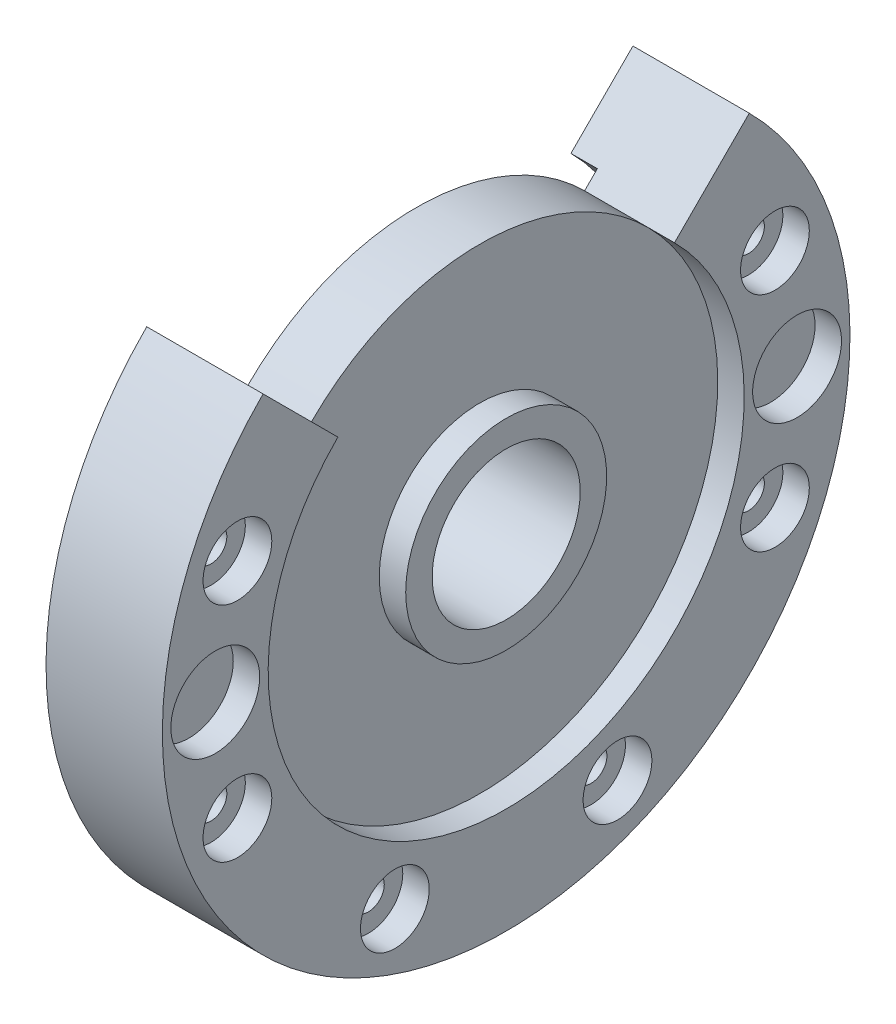
ISO-10303-21;
HEADER;
FILE_DESCRIPTION(('STEP AP214'),'2;1');
FILE_NAME('part.step','',(''),(''),'','','');
FILE_SCHEMA(('AUTOMOTIVE_DESIGN { 1 0 10303 214 1 1 1 1 }'));
ENDSEC;
DATA;
#1=APPLICATION_CONTEXT('core data for automotive mechanical design processes');
#2=APPLICATION_PROTOCOL_DEFINITION('international standard','automotive_design',2000,#1);
#3=PRODUCT_CONTEXT('',#1,'mechanical');
#4=PRODUCT('Part','Part','',(#3));
#5=PRODUCT_RELATED_PRODUCT_CATEGORY('part','',(#4));
#6=PRODUCT_DEFINITION_FORMATION('','',#4);
#7=PRODUCT_DEFINITION_CONTEXT('part definition',#1,'design');
#8=PRODUCT_DEFINITION('design','',#6,#7);
#9=PRODUCT_DEFINITION_SHAPE('','',#8);
#10=(LENGTH_UNIT() NAMED_UNIT(*) SI_UNIT(.MILLI.,.METRE.));
#11=(NAMED_UNIT(*) PLANE_ANGLE_UNIT() SI_UNIT($,.RADIAN.));
#12=(NAMED_UNIT(*) SI_UNIT($,.STERADIAN.) SOLID_ANGLE_UNIT());
#13=UNCERTAINTY_MEASURE_WITH_UNIT(LENGTH_MEASURE(1.E-05),#10,'distance_accuracy_value','');
#14=(GEOMETRIC_REPRESENTATION_CONTEXT(3) GLOBAL_UNCERTAINTY_ASSIGNED_CONTEXT((#13)) GLOBAL_UNIT_ASSIGNED_CONTEXT((#10,
#11,#12)) REPRESENTATION_CONTEXT('',''));
#15=CARTESIAN_POINT('',(0.,0.,0.));
#16=DIRECTION('',(0.,0.,1.));
#17=DIRECTION('',(1.,0.,0.));
#18=AXIS2_PLACEMENT_3D('',#15,#16,#17);
#19=CARTESIAN_POINT('',(0.,0.,0.));
#20=DIRECTION('',(1.,0.,0.));
#21=DIRECTION('',(0.,0.,-1.));
#22=AXIS2_PLACEMENT_3D('',#19,#20,#21);
#23=PLANE('',#22);
#24=CARTESIAN_POINT('',(0.,0.,0.));
#25=DIRECTION('',(1.,0.,0.));
#26=DIRECTION('',(0.,0.,-1.));
#27=AXIS2_PLACEMENT_3D('',#24,#25,#26);
#28=CIRCLE('',#27,7.);
#29=CARTESIAN_POINT('',(0.,0.,-7.));
#30=VERTEX_POINT('',#29);
#31=EDGE_CURVE('E127',#30,#30,#28,.T.);
#32=ORIENTED_EDGE('',*,*,#31,.T.);
#33=EDGE_LOOP('',(#32));
#34=FACE_BOUND('',#33,.T.);
#35=CARTESIAN_POINT('',(0.,0.,0.));
#36=DIRECTION('',(-1.,0.,0.));
#37=DIRECTION('',(0.,0.,1.));
#38=AXIS2_PLACEMENT_3D('',#35,#36,#37);
#39=CIRCLE('',#38,18.21);
#40=CARTESIAN_POINT('',(0.,0.,18.21));
#41=VERTEX_POINT('',#40);
#42=EDGE_CURVE('E262',#41,#41,#39,.T.);
#43=ORIENTED_EDGE('',*,*,#42,.T.);
#44=EDGE_LOOP('',(#43));
#45=FACE_BOUND('',#44,.T.);
#46=ADVANCED_FACE('F41',(#34,#45),#23,.F.);
#47=CARTESIAN_POINT('',(-5.,0.,0.));
#48=DIRECTION('',(1.,0.,0.));
#49=DIRECTION('',(0.,0.,-1.));
#50=AXIS2_PLACEMENT_3D('',#47,#48,#49);
#51=CYLINDRICAL_SURFACE('',#50,22.5);
#52=CARTESIAN_POINT('',(2.5,0.,0.));
#53=DIRECTION('',(-1.,0.,0.));
#54=DIRECTION('',(0.,0.,1.));
#55=AXIS2_PLACEMENT_3D('',#52,#53,#54);
#56=CIRCLE('',#55,22.5);
#57=CARTESIAN_POINT('',(2.5,15.9099025766972,15.9099025766974));
#58=VERTEX_POINT('',#57);
#59=CARTESIAN_POINT('',(2.5,15.9099025766973,-15.9099025766973));
#60=VERTEX_POINT('',#59);
#61=EDGE_CURVE('E56',#58,#60,#56,.T.);
#62=ORIENTED_EDGE('',*,*,#61,.F.);
#63=DIRECTION('',(1.,0.,0.));
#64=VECTOR('',#63,1.);
#65=CARTESIAN_POINT('',(-5.,15.9099025766972,15.9099025766974));
#66=LINE('',#65,#64);
#67=CARTESIAN_POINT('',(8.5,15.9099025766972,15.9099025766974));
#68=VERTEX_POINT('',#67);
#69=EDGE_CURVE('E63',#58,#68,#66,.T.);
#70=ORIENTED_EDGE('',*,*,#69,.T.);
#71=CARTESIAN_POINT('',(8.5,0.,0.));
#72=DIRECTION('',(-1.,0.,0.));
#73=DIRECTION('',(0.,0.,1.));
#74=AXIS2_PLACEMENT_3D('',#71,#72,#73);
#75=CIRCLE('',#74,22.5);
#76=CARTESIAN_POINT('',(8.5,15.9099025766973,-15.9099025766973));
#77=VERTEX_POINT('',#76);
#78=EDGE_CURVE('E159',#68,#77,#75,.T.);
#79=ORIENTED_EDGE('',*,*,#78,.T.);
#80=DIRECTION('',(1.,0.,0.));
#81=VECTOR('',#80,1.);
#82=CARTESIAN_POINT('',(-5.,15.9099025766973,-15.9099025766973));
#83=LINE('',#82,#81);
#84=EDGE_CURVE('E210',#60,#77,#83,.T.);
#85=ORIENTED_EDGE('',*,*,#84,.F.);
#86=EDGE_LOOP('',(#62,#70,#79,#85));
#87=FACE_BOUND('',#86,.T.);
#88=ADVANCED_FACE('F281',(#87),#51,.T.);
#89=CARTESIAN_POINT('',(-5.,10.5237943900396,-25.4066871440605));
#90=DIRECTION('',(1.,0.,0.));
#91=DIRECTION('',(0.,0.,-1.));
#92=AXIS2_PLACEMENT_3D('',#89,#90,#91);
#93=CYLINDRICAL_SURFACE('',#92,1.5);
#94=CARTESIAN_POINT('',(0.,10.5237943900396,-25.4066871440605));
#95=DIRECTION('',(1.,0.,0.));
#96=DIRECTION('',(0.,0.,-1.));
#97=AXIS2_PLACEMENT_3D('',#94,#95,#96);
#98=CIRCLE('',#97,1.5);
#99=CARTESIAN_POINT('',(0.,10.5237943900396,-26.9066871440605));
#100=VERTEX_POINT('',#99);
#101=EDGE_CURVE('E134',#100,#100,#98,.T.);
#102=ORIENTED_EDGE('',*,*,#101,.F.);
#103=EDGE_LOOP('',(#102));
#104=FACE_BOUND('',#103,.T.);
#105=CARTESIAN_POINT('',(8.5,10.5237943900396,-25.4066871440605));
#106=DIRECTION('',(1.,0.,0.));
#107=DIRECTION('',(0.,0.,-1.));
#108=AXIS2_PLACEMENT_3D('',#105,#106,#107);
#109=CIRCLE('',#108,1.5);
#110=CARTESIAN_POINT('',(8.5,10.5237943900396,-26.9066871440605));
#111=VERTEX_POINT('',#110);
#112=EDGE_CURVE('E193',#111,#111,#109,.F.);
#113=ORIENTED_EDGE('',*,*,#112,.F.);
#114=EDGE_LOOP('',(#113));
#115=FACE_BOUND('',#114,.T.);
#116=ADVANCED_FACE('F286',(#104,#115),#93,.F.);
#117=CARTESIAN_POINT('',(-5.,-10.52379439004,-25.4066871440604));
#118=DIRECTION('',(1.,0.,0.));
#119=DIRECTION('',(0.,0.,-1.));
#120=AXIS2_PLACEMENT_3D('',#117,#118,#119);
#121=CYLINDRICAL_SURFACE('',#120,1.5);
#122=CARTESIAN_POINT('',(0.,-10.52379439004,-25.4066871440604));
#123=DIRECTION('',(1.,0.,0.));
#124=DIRECTION('',(0.,0.,-1.));
#125=AXIS2_PLACEMENT_3D('',#122,#123,#124);
#126=CIRCLE('',#125,1.5);
#127=CARTESIAN_POINT('',(0.,-10.52379439004,-26.9066871440604));
#128=VERTEX_POINT('',#127);
#129=EDGE_CURVE('E137',#128,#128,#126,.T.);
#130=ORIENTED_EDGE('',*,*,#129,.F.);
#131=EDGE_LOOP('',(#130));
#132=FACE_BOUND('',#131,.T.);
#133=CARTESIAN_POINT('',(8.5,-10.52379439004,-25.4066871440604));
#134=DIRECTION('',(1.,0.,0.));
#135=DIRECTION('',(0.,0.,-1.));
#136=AXIS2_PLACEMENT_3D('',#133,#134,#135);
#137=CIRCLE('',#136,1.5);
#138=CARTESIAN_POINT('',(8.5,-10.52379439004,-26.9066871440604));
#139=VERTEX_POINT('',#138);
#140=EDGE_CURVE('E188',#139,#139,#137,.F.);
#141=ORIENTED_EDGE('',*,*,#140,.F.);
#142=EDGE_LOOP('',(#141));
#143=FACE_BOUND('',#142,.T.);
#144=ADVANCED_FACE('F314',(#132,#143),#121,.F.);
#145=CARTESIAN_POINT('',(-5.,-25.4066871440604,-10.5237943900399));
#146=DIRECTION('',(1.,0.,0.));
#147=DIRECTION('',(0.,0.,-1.));
#148=AXIS2_PLACEMENT_3D('',#145,#146,#147);
#149=CYLINDRICAL_SURFACE('',#148,1.5);
#150=CARTESIAN_POINT('',(0.,-25.4066871440604,-10.5237943900399));
#151=DIRECTION('',(1.,0.,0.));
#152=DIRECTION('',(0.,0.,-1.));
#153=AXIS2_PLACEMENT_3D('',#150,#151,#152);
#154=CIRCLE('',#153,1.5);
#155=CARTESIAN_POINT('',(0.,-25.4066871440604,-12.0237943900399));
#156=VERTEX_POINT('',#155);
#157=EDGE_CURVE('E140',#156,#156,#154,.T.);
#158=ORIENTED_EDGE('',*,*,#157,.F.);
#159=EDGE_LOOP('',(#158));
#160=FACE_BOUND('',#159,.T.);
#161=CARTESIAN_POINT('',(8.5,-25.4066871440604,-10.5237943900399));
#162=DIRECTION('',(1.,0.,0.));
#163=DIRECTION('',(0.,0.,-1.));
#164=AXIS2_PLACEMENT_3D('',#161,#162,#163);
#165=CIRCLE('',#164,1.5);
#166=CARTESIAN_POINT('',(8.5,-25.4066871440604,-12.0237943900399));
#167=VERTEX_POINT('',#166);
#168=EDGE_CURVE('E183',#167,#167,#165,.F.);
#169=ORIENTED_EDGE('',*,*,#168,.F.);
#170=EDGE_LOOP('',(#169));
#171=FACE_BOUND('',#170,.T.);
#172=ADVANCED_FACE('F395',(#160,#171),#149,.F.);
#173=CARTESIAN_POINT('',(-5.,-25.4066871440603,10.5237943900401));
#174=DIRECTION('',(1.,0.,0.));
#175=DIRECTION('',(0.,0.,-1.));
#176=AXIS2_PLACEMENT_3D('',#173,#174,#175);
#177=CYLINDRICAL_SURFACE('',#176,1.50000000000001);
#178=CARTESIAN_POINT('',(0.,-25.4066871440603,10.5237943900401));
#179=DIRECTION('',(1.,0.,0.));
#180=DIRECTION('',(0.,0.,-1.));
#181=AXIS2_PLACEMENT_3D('',#178,#179,#180);
#182=CIRCLE('',#181,1.50000000000001);
#183=CARTESIAN_POINT('',(0.,-25.4066871440603,9.02379439004007));
#184=VERTEX_POINT('',#183);
#185=EDGE_CURVE('E143',#184,#184,#182,.T.);
#186=ORIENTED_EDGE('',*,*,#185,.F.);
#187=EDGE_LOOP('',(#186));
#188=FACE_BOUND('',#187,.T.);
#189=CARTESIAN_POINT('',(8.5,-25.4066871440603,10.5237943900401));
#190=DIRECTION('',(1.,0.,0.));
#191=DIRECTION('',(0.,0.,-1.));
#192=AXIS2_PLACEMENT_3D('',#189,#190,#191);
#193=CIRCLE('',#192,1.50000000000001);
#194=CARTESIAN_POINT('',(8.5,-25.4066871440603,9.02379439004007));
#195=VERTEX_POINT('',#194);
#196=EDGE_CURVE('E178',#195,#195,#193,.F.);
#197=ORIENTED_EDGE('',*,*,#196,.F.);
#198=EDGE_LOOP('',(#197));
#199=FACE_BOUND('',#198,.T.);
#200=ADVANCED_FACE('F399',(#188,#199),#177,.F.);
#201=CARTESIAN_POINT('',(-5.,-10.5237943900398,25.4066871440604));
#202=DIRECTION('',(1.,0.,0.));
#203=DIRECTION('',(0.,0.,-1.));
#204=AXIS2_PLACEMENT_3D('',#201,#202,#203);
#205=CYLINDRICAL_SURFACE('',#204,1.5);
#206=CARTESIAN_POINT('',(0.,-10.5237943900398,25.4066871440604));
#207=DIRECTION('',(1.,0.,0.));
#208=DIRECTION('',(0.,0.,-1.));
#209=AXIS2_PLACEMENT_3D('',#206,#207,#208);
#210=CIRCLE('',#209,1.5);
#211=CARTESIAN_POINT('',(0.,-10.5237943900398,23.9066871440604));
#212=VERTEX_POINT('',#211);
#213=EDGE_CURVE('E146',#212,#212,#210,.T.);
#214=ORIENTED_EDGE('',*,*,#213,.F.);
#215=EDGE_LOOP('',(#214));
#216=FACE_BOUND('',#215,.T.);
#217=CARTESIAN_POINT('',(8.5,-10.5237943900398,25.4066871440604));
#218=DIRECTION('',(1.,0.,0.));
#219=DIRECTION('',(0.,0.,-1.));
#220=AXIS2_PLACEMENT_3D('',#217,#218,#219);
#221=CIRCLE('',#220,1.5);
#222=CARTESIAN_POINT('',(8.5,-10.5237943900398,23.9066871440604));
#223=VERTEX_POINT('',#222);
#224=EDGE_CURVE('E173',#223,#223,#221,.F.);
#225=ORIENTED_EDGE('',*,*,#224,.F.);
#226=EDGE_LOOP('',(#225));
#227=FACE_BOUND('',#226,.T.);
#228=ADVANCED_FACE('F297',(#216,#227),#205,.F.);
#229=CARTESIAN_POINT('',(-5.,10.5237943900402,25.4066871440603));
#230=DIRECTION('',(1.,0.,0.));
#231=DIRECTION('',(0.,0.,-1.));
#232=AXIS2_PLACEMENT_3D('',#229,#230,#231);
#233=CYLINDRICAL_SURFACE('',#232,1.5);
#234=CARTESIAN_POINT('',(0.,10.5237943900402,25.4066871440603));
#235=DIRECTION('',(1.,0.,0.));
#236=DIRECTION('',(0.,0.,-1.));
#237=AXIS2_PLACEMENT_3D('',#234,#235,#236);
#238=CIRCLE('',#237,1.5);
#239=CARTESIAN_POINT('',(0.,10.5237943900402,23.9066871440603));
#240=VERTEX_POINT('',#239);
#241=EDGE_CURVE('E149',#240,#240,#238,.T.);
#242=ORIENTED_EDGE('',*,*,#241,.F.);
#243=EDGE_LOOP('',(#242));
#244=FACE_BOUND('',#243,.T.);
#245=CARTESIAN_POINT('',(8.5,10.5237943900402,25.4066871440603));
#246=DIRECTION('',(1.,0.,0.));
#247=DIRECTION('',(0.,0.,-1.));
#248=AXIS2_PLACEMENT_3D('',#245,#246,#247);
#249=CIRCLE('',#248,1.5);
#250=CARTESIAN_POINT('',(8.5,10.5237943900402,23.9066871440603));
#251=VERTEX_POINT('',#250);
#252=EDGE_CURVE('E168',#251,#251,#249,.F.);
#253=ORIENTED_EDGE('',*,*,#252,.F.);
#254=EDGE_LOOP('',(#253));
#255=FACE_BOUND('',#254,.T.);
#256=ADVANCED_FACE('F290',(#244,#255),#233,.F.);
#257=ORIENTED_EDGE('',*,*,#241,.T.);
#258=EDGE_LOOP('',(#257));
#259=FACE_BOUND('',#258,.T.);
#260=ORIENTED_EDGE('',*,*,#213,.T.);
#261=EDGE_LOOP('',(#260));
#262=FACE_BOUND('',#261,.T.);
#263=ORIENTED_EDGE('',*,*,#185,.T.);
#264=EDGE_LOOP('',(#263));
#265=FACE_BOUND('',#264,.T.);
#266=ORIENTED_EDGE('',*,*,#157,.T.);
#267=EDGE_LOOP('',(#266));
#268=FACE_BOUND('',#267,.T.);
#269=ORIENTED_EDGE('',*,*,#129,.T.);
#270=EDGE_LOOP('',(#269));
#271=FACE_BOUND('',#270,.T.);
#272=ORIENTED_EDGE('',*,*,#101,.T.);
#273=EDGE_LOOP('',(#272));
#274=FACE_BOUND('',#273,.T.);
#275=DIRECTION('',(0.,0.707106781186544,0.707106781186551));
#276=VECTOR('',#275,1.);
#277=CARTESIAN_POINT('',(0.,0.,0.));
#278=LINE('',#277,#276);
#279=CARTESIAN_POINT('',(0.,17.1190551725262,17.1190551725264));
#280=VERTEX_POINT('',#279);
#281=CARTESIAN_POINT('',(0.,22.9809703885627,22.9809703885629));
#282=VERTEX_POINT('',#281);
#283=EDGE_CURVE('E115',#280,#282,#278,.T.);
#284=ORIENTED_EDGE('',*,*,#283,.F.);
#285=CARTESIAN_POINT('',(0.,0.,0.));
#286=DIRECTION('',(-1.,0.,0.));
#287=DIRECTION('',(0.,0.,1.));
#288=AXIS2_PLACEMENT_3D('',#285,#286,#287);
#289=CIRCLE('',#288,24.21);
#290=CARTESIAN_POINT('',(0.,17.1190551725264,-17.1190551725263));
#291=VERTEX_POINT('',#290);
#292=EDGE_CURVE('E100',#291,#280,#289,.T.);
#293=ORIENTED_EDGE('',*,*,#292,.F.);
#294=DIRECTION('',(0.,0.707106781186549,-0.707106781186546));
#295=VECTOR('',#294,1.);
#296=CARTESIAN_POINT('',(0.,0.,0.));
#297=LINE('',#296,#295);
#298=CARTESIAN_POINT('',(0.,22.9809703885628,-22.9809703885628));
#299=VERTEX_POINT('',#298);
#300=EDGE_CURVE('E124',#291,#299,#297,.T.);
#301=ORIENTED_EDGE('',*,*,#300,.T.);
#302=CARTESIAN_POINT('',(0.,0.,0.));
#303=DIRECTION('',(-1.,0.,0.));
#304=DIRECTION('',(0.,0.,1.));
#305=AXIS2_PLACEMENT_3D('',#302,#303,#304);
#306=CIRCLE('',#305,32.5);
#307=EDGE_CURVE('E122',#299,#282,#306,.T.);
#308=ORIENTED_EDGE('',*,*,#307,.T.);
#309=EDGE_LOOP('',(#284,#293,#301,#308));
#310=FACE_BOUND('',#309,.T.);
#311=ADVANCED_FACE('F43',(#259,#262,#265,#268,#271,#274,#310),#23,.F.);
#312=CARTESIAN_POINT('',(0.,0.,0.));
#313=DIRECTION('',(-1.,0.,0.));
#314=DIRECTION('',(0.,0.,1.));
#315=AXIS2_PLACEMENT_3D('',#312,#313,#314);
#316=CYLINDRICAL_SURFACE('',#315,32.5);
#317=DIRECTION('',(1.,0.,0.));
#318=VECTOR('',#317,1.);
#319=CARTESIAN_POINT('',(-5.,22.9809703885627,22.9809703885629));
#320=LINE('',#319,#318);
#321=CARTESIAN_POINT('',(11.,22.9809703885627,22.9809703885629));
#322=VERTEX_POINT('',#321);
#323=EDGE_CURVE('E209',#282,#322,#320,.T.);
#324=ORIENTED_EDGE('',*,*,#323,.F.);
#325=ORIENTED_EDGE('',*,*,#307,.F.);
#326=DIRECTION('',(1.,0.,0.));
#327=VECTOR('',#326,1.);
#328=CARTESIAN_POINT('',(-5.,22.9809703885628,-22.9809703885628));
#329=LINE('',#328,#327);
#330=CARTESIAN_POINT('',(11.,22.9809703885628,-22.9809703885628));
#331=VERTEX_POINT('',#330);
#332=EDGE_CURVE('E204',#299,#331,#329,.T.);
#333=ORIENTED_EDGE('',*,*,#332,.T.);
#334=CARTESIAN_POINT('',(11.,0.,0.));
#335=DIRECTION('',(-1.,0.,0.));
#336=DIRECTION('',(0.,0.,1.));
#337=AXIS2_PLACEMENT_3D('',#334,#335,#336);
#338=CIRCLE('',#337,32.5);
#339=EDGE_CURVE('E164',#331,#322,#338,.T.);
#340=ORIENTED_EDGE('',*,*,#339,.T.);
#341=EDGE_LOOP('',(#324,#325,#333,#340));
#342=FACE_BOUND('',#341,.T.);
#343=ADVANCED_FACE('F212',(#342),#316,.T.);
#344=CARTESIAN_POINT('',(11.,32.5,0.));
#345=DIRECTION('',(-1.,0.,0.));
#346=DIRECTION('',(0.,0.,1.));
#347=AXIS2_PLACEMENT_3D('',#344,#345,#346);
#348=PLANE('',#347);
#349=CARTESIAN_POINT('',(11.,10.5237943900396,-25.4066871440605));
#350=DIRECTION('',(1.,0.,0.));
#351=DIRECTION('',(0.,0.,-1.));
#352=AXIS2_PLACEMENT_3D('',#349,#350,#351);
#353=CIRCLE('',#352,3.25);
#354=CARTESIAN_POINT('',(11.,10.5237943900396,-28.6566871440605));
#355=VERTEX_POINT('',#354);
#356=EDGE_CURVE('E196',#355,#355,#353,.T.);
#357=ORIENTED_EDGE('',*,*,#356,.F.);
#358=EDGE_LOOP('',(#357));
#359=FACE_BOUND('',#358,.T.);
#360=CARTESIAN_POINT('',(11.,-10.52379439004,-25.4066871440604));
#361=DIRECTION('',(1.,0.,0.));
#362=DIRECTION('',(0.,0.,-1.));
#363=AXIS2_PLACEMENT_3D('',#360,#361,#362);
#364=CIRCLE('',#363,3.25);
#365=CARTESIAN_POINT('',(11.,-10.52379439004,-28.6566871440604));
#366=VERTEX_POINT('',#365);
#367=EDGE_CURVE('E192',#366,#366,#364,.T.);
#368=ORIENTED_EDGE('',*,*,#367,.F.);
#369=EDGE_LOOP('',(#368));
#370=FACE_BOUND('',#369,.T.);
#371=CARTESIAN_POINT('',(11.,-25.4066871440604,-10.5237943900399));
#372=DIRECTION('',(1.,0.,0.));
#373=DIRECTION('',(0.,0.,-1.));
#374=AXIS2_PLACEMENT_3D('',#371,#372,#373);
#375=CIRCLE('',#374,3.25);
#376=CARTESIAN_POINT('',(11.,-25.4066871440604,-13.7737943900399));
#377=VERTEX_POINT('',#376);
#378=EDGE_CURVE('E187',#377,#377,#375,.T.);
#379=ORIENTED_EDGE('',*,*,#378,.F.);
#380=EDGE_LOOP('',(#379));
#381=FACE_BOUND('',#380,.T.);
#382=CARTESIAN_POINT('',(11.,-25.4066871440604,10.5237943900401));
#383=DIRECTION('',(1.,0.,0.));
#384=DIRECTION('',(0.,0.,-1.));
#385=AXIS2_PLACEMENT_3D('',#382,#383,#384);
#386=CIRCLE('',#385,3.25);
#387=CARTESIAN_POINT('',(11.,-25.4066871440604,7.27379439004008));
#388=VERTEX_POINT('',#387);
#389=EDGE_CURVE('E182',#388,#388,#386,.T.);
#390=ORIENTED_EDGE('',*,*,#389,.F.);
#391=EDGE_LOOP('',(#390));
#392=FACE_BOUND('',#391,.T.);
#393=CARTESIAN_POINT('',(11.,-10.5237943900398,25.4066871440604));
#394=DIRECTION('',(1.,0.,0.));
#395=DIRECTION('',(0.,0.,-1.));
#396=AXIS2_PLACEMENT_3D('',#393,#394,#395);
#397=CIRCLE('',#396,3.25);
#398=CARTESIAN_POINT('',(11.,-10.5237943900398,22.1566871440604));
#399=VERTEX_POINT('',#398);
#400=EDGE_CURVE('E177',#399,#399,#397,.T.);
#401=ORIENTED_EDGE('',*,*,#400,.F.);
#402=EDGE_LOOP('',(#401));
#403=FACE_BOUND('',#402,.T.);
#404=CARTESIAN_POINT('',(11.,10.5237943900402,25.4066871440603));
#405=DIRECTION('',(1.,0.,0.));
#406=DIRECTION('',(0.,0.,-1.));
#407=AXIS2_PLACEMENT_3D('',#404,#405,#406);
#408=CIRCLE('',#407,3.25);
#409=CARTESIAN_POINT('',(11.,10.5237943900402,22.1566871440603));
#410=VERTEX_POINT('',#409);
#411=EDGE_CURVE('E176',#410,#410,#408,.T.);
#412=ORIENTED_EDGE('',*,*,#411,.F.);
#413=EDGE_LOOP('',(#412));
#414=FACE_BOUND('',#413,.T.);
#415=CARTESIAN_POINT('',(11.,-1.92031473636372E-13,27.5));
#416=DIRECTION('',(1.,0.,0.));
#417=DIRECTION('',(0.,0.,-1.));
#418=AXIS2_PLACEMENT_3D('',#415,#416,#417);
#419=CIRCLE('',#418,4.2);
#420=CARTESIAN_POINT('',(11.,-1.92031473636372E-13,23.3));
#421=VERTEX_POINT('',#420);
#422=EDGE_CURVE('E171',#421,#421,#419,.T.);
#423=ORIENTED_EDGE('',*,*,#422,.F.);
#424=EDGE_LOOP('',(#423));
#425=FACE_BOUND('',#424,.T.);
#426=CARTESIAN_POINT('',(11.,0.,-27.5));
#427=DIRECTION('',(1.,0.,0.));
#428=DIRECTION('',(0.,0.,-1.));
#429=AXIS2_PLACEMENT_3D('',#426,#427,#428);
#430=CIRCLE('',#429,4.2);
#431=CARTESIAN_POINT('',(11.,0.,-31.7));
#432=VERTEX_POINT('',#431);
#433=EDGE_CURVE('E226',#432,#432,#430,.T.);
#434=ORIENTED_EDGE('',*,*,#433,.F.);
#435=EDGE_LOOP('',(#434));
#436=FACE_BOUND('',#435,.T.);
#437=DIRECTION('',(0.,0.707106781186544,0.707106781186551));
#438=VECTOR('',#437,1.);
#439=CARTESIAN_POINT('',(11.,0.,0.));
#440=LINE('',#439,#438);
#441=CARTESIAN_POINT('',(11.,15.9099025766972,15.9099025766974));
#442=VERTEX_POINT('',#441);
#443=EDGE_CURVE('E220',#442,#322,#440,.T.);
#444=ORIENTED_EDGE('',*,*,#443,.T.);
#445=ORIENTED_EDGE('',*,*,#339,.F.);
#446=DIRECTION('',(0.,0.707106781186549,-0.707106781186546));
#447=VECTOR('',#446,1.);
#448=CARTESIAN_POINT('',(11.,0.,0.));
#449=LINE('',#448,#447);
#450=CARTESIAN_POINT('',(11.,15.9099025766973,-15.9099025766973));
#451=VERTEX_POINT('',#450);
#452=EDGE_CURVE('E206',#451,#331,#449,.T.);
#453=ORIENTED_EDGE('',*,*,#452,.F.);
#454=CARTESIAN_POINT('',(11.,0.,0.));
#455=DIRECTION('',(-1.,0.,0.));
#456=DIRECTION('',(0.,0.,1.));
#457=AXIS2_PLACEMENT_3D('',#454,#455,#456);
#458=CIRCLE('',#457,22.5);
#459=EDGE_CURVE('E161',#451,#442,#458,.T.);
#460=ORIENTED_EDGE('',*,*,#459,.T.);
#461=EDGE_LOOP('',(#444,#445,#453,#460));
#462=FACE_BOUND('',#461,.T.);
#463=ADVANCED_FACE('F296',(#359,#370,#381,#392,#403,#414,#425,#436,#462),#348,.F.);
#464=CARTESIAN_POINT('',(0.,0.,0.));
#465=DIRECTION('',(-1.,0.,0.));
#466=DIRECTION('',(0.,0.,1.));
#467=AXIS2_PLACEMENT_3D('',#464,#465,#466);
#468=CYLINDRICAL_SURFACE('',#467,22.5);
#469=EDGE_CURVE('E214',#68,#442,#66,.T.);
#470=ORIENTED_EDGE('',*,*,#469,.T.);
#471=ORIENTED_EDGE('',*,*,#459,.F.);
#472=EDGE_CURVE('E219',#77,#451,#83,.T.);
#473=ORIENTED_EDGE('',*,*,#472,.F.);
#474=EDGE_CURVE('E158',#77,#68,#75,.T.);
#475=ORIENTED_EDGE('',*,*,#474,.T.);
#476=EDGE_LOOP('',(#470,#471,#473,#475));
#477=FACE_BOUND('',#476,.T.);
#478=ADVANCED_FACE('F417',(#477),#468,.F.);
#479=CARTESIAN_POINT('',(8.5,22.5,0.));
#480=DIRECTION('',(-1.,0.,0.));
#481=DIRECTION('',(0.,0.,1.));
#482=AXIS2_PLACEMENT_3D('',#479,#480,#481);
#483=PLANE('',#482);
#484=ORIENTED_EDGE('',*,*,#78,.F.);
#485=ORIENTED_EDGE('',*,*,#474,.F.);
#486=EDGE_LOOP('',(#484,#485));
#487=FACE_BOUND('',#486,.T.);
#488=CARTESIAN_POINT('',(8.5,0.,0.));
#489=DIRECTION('',(-1.,0.,0.));
#490=DIRECTION('',(0.,0.,1.));
#491=AXIS2_PLACEMENT_3D('',#488,#489,#490);
#492=CIRCLE('',#491,9.5);
#493=CARTESIAN_POINT('',(8.5,0.,9.5));
#494=VERTEX_POINT('',#493);
#495=EDGE_CURVE('E155',#494,#494,#492,.T.);
#496=ORIENTED_EDGE('',*,*,#495,.T.);
#497=EDGE_LOOP('',(#496));
#498=FACE_BOUND('',#497,.T.);
#499=ADVANCED_FACE('F413',(#487,#498),#483,.F.);
#500=CARTESIAN_POINT('',(0.,0.,0.));
#501=DIRECTION('',(-1.,0.,0.));
#502=DIRECTION('',(0.,0.,1.));
#503=AXIS2_PLACEMENT_3D('',#500,#501,#502);
#504=CYLINDRICAL_SURFACE('',#503,9.5);
#505=ORIENTED_EDGE('',*,*,#495,.F.);
#506=EDGE_LOOP('',(#505));
#507=FACE_BOUND('',#506,.T.);
#508=CARTESIAN_POINT('',(11.,0.,0.));
#509=DIRECTION('',(-1.,0.,0.));
#510=DIRECTION('',(0.,0.,1.));
#511=AXIS2_PLACEMENT_3D('',#508,#509,#510);
#512=CIRCLE('',#511,9.5);
#513=CARTESIAN_POINT('',(11.,0.,9.5));
#514=VERTEX_POINT('',#513);
#515=EDGE_CURVE('E152',#514,#514,#512,.T.);
#516=ORIENTED_EDGE('',*,*,#515,.T.);
#517=EDGE_LOOP('',(#516));
#518=FACE_BOUND('',#517,.T.);
#519=ADVANCED_FACE('F409',(#507,#518),#504,.T.);
#520=CARTESIAN_POINT('',(11.,9.5,0.));
#521=DIRECTION('',(-1.,0.,0.));
#522=DIRECTION('',(0.,0.,1.));
#523=AXIS2_PLACEMENT_3D('',#520,#521,#522);
#524=PLANE('',#523);
#525=CARTESIAN_POINT('',(11.,0.,0.));
#526=DIRECTION('',(1.,0.,0.));
#527=DIRECTION('',(0.,0.,-1.));
#528=AXIS2_PLACEMENT_3D('',#525,#526,#527);
#529=CIRCLE('',#528,7.);
#530=CARTESIAN_POINT('',(11.,0.,-7.));
#531=VERTEX_POINT('',#530);
#532=EDGE_CURVE('E123',#531,#531,#529,.T.);
#533=ORIENTED_EDGE('',*,*,#532,.F.);
#534=EDGE_LOOP('',(#533));
#535=FACE_BOUND('',#534,.T.);
#536=ORIENTED_EDGE('',*,*,#515,.F.);
#537=EDGE_LOOP('',(#536));
#538=FACE_BOUND('',#537,.T.);
#539=ADVANCED_FACE('F390',(#535,#538),#524,.F.);
#540=CARTESIAN_POINT('',(-5.,0.,0.));
#541=DIRECTION('',(1.,0.,0.));
#542=DIRECTION('',(0.,0.,-1.));
#543=AXIS2_PLACEMENT_3D('',#540,#541,#542);
#544=CYLINDRICAL_SURFACE('',#543,7.);
#545=ORIENTED_EDGE('',*,*,#532,.T.);
#546=EDGE_LOOP('',(#545));
#547=FACE_BOUND('',#546,.T.);
#548=ORIENTED_EDGE('',*,*,#31,.F.);
#549=EDGE_LOOP('',(#548));
#550=FACE_BOUND('',#549,.T.);
#551=ADVANCED_FACE('F386',(#547,#550),#544,.F.);
#552=CARTESIAN_POINT('',(-5.,0.,0.));
#553=DIRECTION('',(0.,0.707106781186552,-0.707106781186544));
#554=DIRECTION('',(0.,0.707106781186544,0.707106781186551));
#555=AXIS2_PLACEMENT_3D('',#552,#553,#554);
#556=PLANE('',#555);
#557=DIRECTION('',(-1.,0.,0.));
#558=VECTOR('',#557,1.);
#559=CARTESIAN_POINT('',(2.5,17.1190551725262,17.1190551725264));
#560=LINE('',#559,#558);
#561=CARTESIAN_POINT('',(2.5,17.1190551725262,17.1190551725264));
#562=VERTEX_POINT('',#561);
#563=EDGE_CURVE('E104',#280,#562,#560,.F.);
#564=ORIENTED_EDGE('',*,*,#563,.F.);
#565=ORIENTED_EDGE('',*,*,#283,.T.);
#566=ORIENTED_EDGE('',*,*,#323,.T.);
#567=ORIENTED_EDGE('',*,*,#443,.F.);
#568=ORIENTED_EDGE('',*,*,#469,.F.);
#569=ORIENTED_EDGE('',*,*,#69,.F.);
#570=DIRECTION('',(0.,0.707106781186544,0.707106781186551));
#571=VECTOR('',#570,1.);
#572=CARTESIAN_POINT('',(2.5,0.,0.));
#573=LINE('',#572,#571);
#574=EDGE_CURVE('E117',#58,#562,#573,.T.);
#575=ORIENTED_EDGE('',*,*,#574,.T.);
#576=EDGE_LOOP('',(#564,#565,#566,#567,#568,#569,#575));
#577=FACE_BOUND('',#576,.T.);
#578=ADVANCED_FACE('F114',(#577),#556,.T.);
#579=CARTESIAN_POINT('',(-5.,0.,0.));
#580=DIRECTION('',(0.,-0.707106781186546,-0.707106781186549));
#581=DIRECTION('',(0.,0.707106781186549,-0.707106781186546));
#582=AXIS2_PLACEMENT_3D('',#579,#580,#581);
#583=PLANE('',#582);
#584=ORIENTED_EDGE('',*,*,#300,.F.);
#585=DIRECTION('',(-1.,0.,0.));
#586=VECTOR('',#585,1.);
#587=CARTESIAN_POINT('',(2.5,17.1190551725264,-17.1190551725263));
#588=LINE('',#587,#586);
#589=CARTESIAN_POINT('',(2.5,17.1190551725264,-17.1190551725263));
#590=VERTEX_POINT('',#589);
#591=EDGE_CURVE('E12',#291,#590,#588,.F.);
#592=ORIENTED_EDGE('',*,*,#591,.T.);
#593=DIRECTION('',(0.,0.707106781186549,-0.707106781186546));
#594=VECTOR('',#593,1.);
#595=CARTESIAN_POINT('',(2.5,0.,0.));
#596=LINE('',#595,#594);
#597=EDGE_CURVE('E49',#60,#590,#596,.T.);
#598=ORIENTED_EDGE('',*,*,#597,.F.);
#599=ORIENTED_EDGE('',*,*,#84,.T.);
#600=ORIENTED_EDGE('',*,*,#472,.T.);
#601=ORIENTED_EDGE('',*,*,#452,.T.);
#602=ORIENTED_EDGE('',*,*,#332,.F.);
#603=EDGE_LOOP('',(#584,#592,#598,#599,#600,#601,#602));
#604=FACE_BOUND('',#603,.T.);
#605=ADVANCED_FACE('F201',(#604),#583,.F.);
#606=CARTESIAN_POINT('',(8.5,0.,-27.5));
#607=DIRECTION('',(1.,0.,0.));
#608=DIRECTION('',(0.,0.,-1.));
#609=AXIS2_PLACEMENT_3D('',#606,#607,#608);
#610=CYLINDRICAL_SURFACE('',#609,4.2);
#611=CARTESIAN_POINT('',(8.5,0.,-27.5));
#612=DIRECTION('',(1.,0.,0.));
#613=DIRECTION('',(0.,0.,-1.));
#614=AXIS2_PLACEMENT_3D('',#611,#612,#613);
#615=CIRCLE('',#614,4.2);
#616=CARTESIAN_POINT('',(8.5,0.,-31.7));
#617=VERTEX_POINT('',#616);
#618=EDGE_CURVE('E223',#617,#617,#615,.T.);
#619=ORIENTED_EDGE('',*,*,#618,.F.);
#620=EDGE_LOOP('',(#619));
#621=FACE_BOUND('',#620,.T.);
#622=ORIENTED_EDGE('',*,*,#433,.T.);
#623=EDGE_LOOP('',(#622));
#624=FACE_BOUND('',#623,.T.);
#625=ADVANCED_FACE('F379',(#621,#624),#610,.F.);
#626=CARTESIAN_POINT('',(8.5,0.,0.));
#627=DIRECTION('',(1.,0.,0.));
#628=DIRECTION('',(0.,0.,-1.));
#629=AXIS2_PLACEMENT_3D('',#626,#627,#628);
#630=PLANE('',#629);
#631=ORIENTED_EDGE('',*,*,#618,.T.);
#632=EDGE_LOOP('',(#631));
#633=FACE_BOUND('',#632,.T.);
#634=ADVANCED_FACE('F375',(#633),#630,.T.);
#635=CARTESIAN_POINT('',(8.5,-1.92031473636372E-13,27.5));
#636=DIRECTION('',(1.,0.,0.));
#637=DIRECTION('',(0.,0.,-1.));
#638=AXIS2_PLACEMENT_3D('',#635,#636,#637);
#639=CYLINDRICAL_SURFACE('',#638,4.2);
#640=CARTESIAN_POINT('',(8.5,-1.92031473636372E-13,27.5));
#641=DIRECTION('',(1.,0.,0.));
#642=DIRECTION('',(0.,0.,-1.));
#643=AXIS2_PLACEMENT_3D('',#640,#641,#642);
#644=CIRCLE('',#643,4.2);
#645=CARTESIAN_POINT('',(8.5,-1.92031473636372E-13,23.3));
#646=VERTEX_POINT('',#645);
#647=EDGE_CURVE('E229',#646,#646,#644,.T.);
#648=ORIENTED_EDGE('',*,*,#647,.F.);
#649=EDGE_LOOP('',(#648));
#650=FACE_BOUND('',#649,.T.);
#651=ORIENTED_EDGE('',*,*,#422,.T.);
#652=EDGE_LOOP('',(#651));
#653=FACE_BOUND('',#652,.T.);
#654=ADVANCED_FACE('F371',(#650,#653),#639,.F.);
#655=CARTESIAN_POINT('',(8.5,0.,0.));
#656=DIRECTION('',(1.,0.,0.));
#657=DIRECTION('',(0.,0.,-1.));
#658=AXIS2_PLACEMENT_3D('',#655,#656,#657);
#659=PLANE('',#658);
#660=ORIENTED_EDGE('',*,*,#647,.T.);
#661=EDGE_LOOP('',(#660));
#662=FACE_BOUND('',#661,.T.);
#663=ADVANCED_FACE('F364',(#662),#659,.T.);
#664=CARTESIAN_POINT('',(8.5,10.5237943900402,25.4066871440603));
#665=DIRECTION('',(1.,0.,0.));
#666=DIRECTION('',(0.,0.,-1.));
#667=AXIS2_PLACEMENT_3D('',#664,#665,#666);
#668=PLANE('',#667);
#669=CARTESIAN_POINT('',(8.5,10.5237943900402,25.4066871440603));
#670=DIRECTION('',(1.,0.,0.));
#671=DIRECTION('',(0.,0.,-1.));
#672=AXIS2_PLACEMENT_3D('',#669,#670,#671);
#673=CIRCLE('',#672,3.25);
#674=CARTESIAN_POINT('',(8.5,10.5237943900402,22.1566871440603));
#675=VERTEX_POINT('',#674);
#676=EDGE_CURVE('E172',#675,#675,#673,.T.);
#677=ORIENTED_EDGE('',*,*,#676,.T.);
#678=EDGE_LOOP('',(#677));
#679=FACE_BOUND('',#678,.T.);
#680=ORIENTED_EDGE('',*,*,#252,.T.);
#681=EDGE_LOOP('',(#680));
#682=FACE_BOUND('',#681,.T.);
#683=ADVANCED_FACE('F361',(#679,#682),#668,.T.);
#684=CARTESIAN_POINT('',(8.5,10.5237943900402,25.4066871440603));
#685=DIRECTION('',(1.,0.,0.));
#686=DIRECTION('',(0.,0.,-1.));
#687=AXIS2_PLACEMENT_3D('',#684,#685,#686);
#688=CYLINDRICAL_SURFACE('',#687,3.25);
#689=ORIENTED_EDGE('',*,*,#676,.F.);
#690=EDGE_LOOP('',(#689));
#691=FACE_BOUND('',#690,.T.);
#692=ORIENTED_EDGE('',*,*,#411,.T.);
#693=EDGE_LOOP('',(#692));
#694=FACE_BOUND('',#693,.T.);
#695=ADVANCED_FACE('F359',(#691,#694),#688,.F.);
#696=CARTESIAN_POINT('',(8.5,-10.5237943900398,25.4066871440604));
#697=DIRECTION('',(1.,0.,0.));
#698=DIRECTION('',(0.,0.,-1.));
#699=AXIS2_PLACEMENT_3D('',#696,#697,#698);
#700=PLANE('',#699);
#701=CARTESIAN_POINT('',(8.5,-10.5237943900398,25.4066871440604));
#702=DIRECTION('',(1.,0.,0.));
#703=DIRECTION('',(0.,0.,-1.));
#704=AXIS2_PLACEMENT_3D('',#701,#702,#703);
#705=CIRCLE('',#704,3.25);
#706=CARTESIAN_POINT('',(8.5,-10.5237943900398,22.1566871440604));
#707=VERTEX_POINT('',#706);
#708=EDGE_CURVE('E181',#707,#707,#705,.T.);
#709=ORIENTED_EDGE('',*,*,#708,.T.);
#710=EDGE_LOOP('',(#709));
#711=FACE_BOUND('',#710,.T.);
#712=ORIENTED_EDGE('',*,*,#224,.T.);
#713=EDGE_LOOP('',(#712));
#714=FACE_BOUND('',#713,.T.);
#715=ADVANCED_FACE('F355',(#711,#714),#700,.T.);
#716=CARTESIAN_POINT('',(8.5,-10.5237943900398,25.4066871440604));
#717=DIRECTION('',(1.,0.,0.));
#718=DIRECTION('',(0.,0.,-1.));
#719=AXIS2_PLACEMENT_3D('',#716,#717,#718);
#720=CYLINDRICAL_SURFACE('',#719,3.25);
#721=ORIENTED_EDGE('',*,*,#708,.F.);
#722=EDGE_LOOP('',(#721));
#723=FACE_BOUND('',#722,.T.);
#724=ORIENTED_EDGE('',*,*,#400,.T.);
#725=EDGE_LOOP('',(#724));
#726=FACE_BOUND('',#725,.T.);
#727=ADVANCED_FACE('F351',(#723,#726),#720,.F.);
#728=CARTESIAN_POINT('',(8.5,-25.4066871440604,10.5237943900401));
#729=DIRECTION('',(1.,0.,0.));
#730=DIRECTION('',(0.,0.,-1.));
#731=AXIS2_PLACEMENT_3D('',#728,#729,#730);
#732=PLANE('',#731);
#733=CARTESIAN_POINT('',(8.5,-25.4066871440604,10.5237943900401));
#734=DIRECTION('',(1.,0.,0.));
#735=DIRECTION('',(0.,0.,-1.));
#736=AXIS2_PLACEMENT_3D('',#733,#734,#735);
#737=CIRCLE('',#736,3.25);
#738=CARTESIAN_POINT('',(8.5,-25.4066871440604,7.27379439004008));
#739=VERTEX_POINT('',#738);
#740=EDGE_CURVE('E186',#739,#739,#737,.T.);
#741=ORIENTED_EDGE('',*,*,#740,.T.);
#742=EDGE_LOOP('',(#741));
#743=FACE_BOUND('',#742,.T.);
#744=ORIENTED_EDGE('',*,*,#196,.T.);
#745=EDGE_LOOP('',(#744));
#746=FACE_BOUND('',#745,.T.);
#747=ADVANCED_FACE('F347',(#743,#746),#732,.T.);
#748=CARTESIAN_POINT('',(8.5,-25.4066871440604,10.5237943900401));
#749=DIRECTION('',(1.,0.,0.));
#750=DIRECTION('',(0.,0.,-1.));
#751=AXIS2_PLACEMENT_3D('',#748,#749,#750);
#752=CYLINDRICAL_SURFACE('',#751,3.25);
#753=ORIENTED_EDGE('',*,*,#740,.F.);
#754=EDGE_LOOP('',(#753));
#755=FACE_BOUND('',#754,.T.);
#756=ORIENTED_EDGE('',*,*,#389,.T.);
#757=EDGE_LOOP('',(#756));
#758=FACE_BOUND('',#757,.T.);
#759=ADVANCED_FACE('F343',(#755,#758),#752,.F.);
#760=CARTESIAN_POINT('',(8.5,-25.4066871440604,-10.5237943900399));
#761=DIRECTION('',(1.,0.,0.));
#762=DIRECTION('',(0.,0.,-1.));
#763=AXIS2_PLACEMENT_3D('',#760,#761,#762);
#764=PLANE('',#763);
#765=CARTESIAN_POINT('',(8.5,-25.4066871440604,-10.5237943900399));
#766=DIRECTION('',(1.,0.,0.));
#767=DIRECTION('',(0.,0.,-1.));
#768=AXIS2_PLACEMENT_3D('',#765,#766,#767);
#769=CIRCLE('',#768,3.25);
#770=CARTESIAN_POINT('',(8.5,-25.4066871440604,-13.7737943900399));
#771=VERTEX_POINT('',#770);
#772=EDGE_CURVE('E191',#771,#771,#769,.T.);
#773=ORIENTED_EDGE('',*,*,#772,.T.);
#774=EDGE_LOOP('',(#773));
#775=FACE_BOUND('',#774,.T.);
#776=ORIENTED_EDGE('',*,*,#168,.T.);
#777=EDGE_LOOP('',(#776));
#778=FACE_BOUND('',#777,.T.);
#779=ADVANCED_FACE('F339',(#775,#778),#764,.T.);
#780=CARTESIAN_POINT('',(8.5,-25.4066871440604,-10.5237943900399));
#781=DIRECTION('',(1.,0.,0.));
#782=DIRECTION('',(0.,0.,-1.));
#783=AXIS2_PLACEMENT_3D('',#780,#781,#782);
#784=CYLINDRICAL_SURFACE('',#783,3.25);
#785=ORIENTED_EDGE('',*,*,#772,.F.);
#786=EDGE_LOOP('',(#785));
#787=FACE_BOUND('',#786,.T.);
#788=ORIENTED_EDGE('',*,*,#378,.T.);
#789=EDGE_LOOP('',(#788));
#790=FACE_BOUND('',#789,.T.);
#791=ADVANCED_FACE('F335',(#787,#790),#784,.F.);
#792=CARTESIAN_POINT('',(8.5,-10.52379439004,-25.4066871440604));
#793=DIRECTION('',(1.,0.,0.));
#794=DIRECTION('',(0.,0.,-1.));
#795=AXIS2_PLACEMENT_3D('',#792,#793,#794);
#796=PLANE('',#795);
#797=CARTESIAN_POINT('',(8.5,-10.52379439004,-25.4066871440604));
#798=DIRECTION('',(1.,0.,0.));
#799=DIRECTION('',(0.,0.,-1.));
#800=AXIS2_PLACEMENT_3D('',#797,#798,#799);
#801=CIRCLE('',#800,3.25);
#802=CARTESIAN_POINT('',(8.5,-10.52379439004,-28.6566871440604));
#803=VERTEX_POINT('',#802);
#804=EDGE_CURVE('E195',#803,#803,#801,.T.);
#805=ORIENTED_EDGE('',*,*,#804,.T.);
#806=EDGE_LOOP('',(#805));
#807=FACE_BOUND('',#806,.T.);
#808=ORIENTED_EDGE('',*,*,#140,.T.);
#809=EDGE_LOOP('',(#808));
#810=FACE_BOUND('',#809,.T.);
#811=ADVANCED_FACE('F329',(#807,#810),#796,.T.);
#812=CARTESIAN_POINT('',(8.5,-10.52379439004,-25.4066871440604));
#813=DIRECTION('',(1.,0.,0.));
#814=DIRECTION('',(0.,0.,-1.));
#815=AXIS2_PLACEMENT_3D('',#812,#813,#814);
#816=CYLINDRICAL_SURFACE('',#815,3.25);
#817=ORIENTED_EDGE('',*,*,#804,.F.);
#818=EDGE_LOOP('',(#817));
#819=FACE_BOUND('',#818,.T.);
#820=ORIENTED_EDGE('',*,*,#367,.T.);
#821=EDGE_LOOP('',(#820));
#822=FACE_BOUND('',#821,.T.);
#823=ADVANCED_FACE('F320',(#819,#822),#816,.F.);
#824=CARTESIAN_POINT('',(8.5,10.5237943900396,-25.4066871440605));
#825=DIRECTION('',(1.,0.,0.));
#826=DIRECTION('',(0.,0.,-1.));
#827=AXIS2_PLACEMENT_3D('',#824,#825,#826);
#828=PLANE('',#827);
#829=CARTESIAN_POINT('',(8.5,10.5237943900396,-25.4066871440605));
#830=DIRECTION('',(1.,0.,0.));
#831=DIRECTION('',(0.,0.,-1.));
#832=AXIS2_PLACEMENT_3D('',#829,#830,#831);
#833=CIRCLE('',#832,3.25);
#834=CARTESIAN_POINT('',(8.5,10.5237943900396,-28.6566871440605));
#835=VERTEX_POINT('',#834);
#836=EDGE_CURVE('E118',#835,#835,#833,.T.);
#837=ORIENTED_EDGE('',*,*,#836,.T.);
#838=EDGE_LOOP('',(#837));
#839=FACE_BOUND('',#838,.T.);
#840=ORIENTED_EDGE('',*,*,#112,.T.);
#841=EDGE_LOOP('',(#840));
#842=FACE_BOUND('',#841,.T.);
#843=ADVANCED_FACE('F318',(#839,#842),#828,.T.);
#844=CARTESIAN_POINT('',(8.5,10.5237943900396,-25.4066871440605));
#845=DIRECTION('',(1.,0.,0.));
#846=DIRECTION('',(0.,0.,-1.));
#847=AXIS2_PLACEMENT_3D('',#844,#845,#846);
#848=CYLINDRICAL_SURFACE('',#847,3.25);
#849=ORIENTED_EDGE('',*,*,#836,.F.);
#850=EDGE_LOOP('',(#849));
#851=FACE_BOUND('',#850,.T.);
#852=ORIENTED_EDGE('',*,*,#356,.T.);
#853=EDGE_LOOP('',(#852));
#854=FACE_BOUND('',#853,.T.);
#855=ADVANCED_FACE('F278',(#851,#854),#848,.F.);
#856=CARTESIAN_POINT('',(2.5,0.,0.));
#857=DIRECTION('',(-1.,0.,0.));
#858=DIRECTION('',(0.,0.,1.));
#859=AXIS2_PLACEMENT_3D('',#856,#857,#858);
#860=CYLINDRICAL_SURFACE('',#859,24.21);
#861=ORIENTED_EDGE('',*,*,#563,.T.);
#862=CARTESIAN_POINT('',(2.5,0.,0.));
#863=DIRECTION('',(-1.,0.,0.));
#864=DIRECTION('',(0.,0.,1.));
#865=AXIS2_PLACEMENT_3D('',#862,#863,#864);
#866=CIRCLE('',#865,24.21);
#867=EDGE_CURVE('E109',#590,#562,#866,.T.);
#868=ORIENTED_EDGE('',*,*,#867,.F.);
#869=ORIENTED_EDGE('',*,*,#591,.F.);
#870=ORIENTED_EDGE('',*,*,#292,.T.);
#871=EDGE_LOOP('',(#861,#868,#869,#870));
#872=FACE_BOUND('',#871,.T.);
#873=ADVANCED_FACE('F102',(#872),#860,.F.);
#874=CARTESIAN_POINT('',(2.5,0.,0.));
#875=DIRECTION('',(-1.,0.,0.));
#876=DIRECTION('',(0.,0.,1.));
#877=AXIS2_PLACEMENT_3D('',#874,#875,#876);
#878=PLANE('',#877);
#879=CARTESIAN_POINT('',(2.5,0.,0.));
#880=DIRECTION('',(-1.,0.,0.));
#881=DIRECTION('',(0.,0.,1.));
#882=AXIS2_PLACEMENT_3D('',#879,#880,#881);
#883=CIRCLE('',#882,18.21);
#884=CARTESIAN_POINT('',(2.5,0.,18.21));
#885=VERTEX_POINT('',#884);
#886=EDGE_CURVE('E110',#885,#885,#883,.T.);
#887=ORIENTED_EDGE('',*,*,#886,.F.);
#888=EDGE_LOOP('',(#887));
#889=FACE_BOUND('',#888,.T.);
#890=ORIENTED_EDGE('',*,*,#61,.T.);
#891=ORIENTED_EDGE('',*,*,#597,.T.);
#892=ORIENTED_EDGE('',*,*,#867,.T.);
#893=ORIENTED_EDGE('',*,*,#574,.F.);
#894=EDGE_LOOP('',(#890,#891,#892,#893));
#895=FACE_BOUND('',#894,.T.);
#896=ADVANCED_FACE('F197',(#889,#895),#878,.T.);
#897=CARTESIAN_POINT('',(2.5,0.,0.));
#898=DIRECTION('',(-1.,0.,0.));
#899=DIRECTION('',(0.,0.,1.));
#900=AXIS2_PLACEMENT_3D('',#897,#898,#899);
#901=CYLINDRICAL_SURFACE('',#900,18.21);
#902=ORIENTED_EDGE('',*,*,#886,.T.);
#903=EDGE_LOOP('',(#902));
#904=FACE_BOUND('',#903,.T.);
#905=ORIENTED_EDGE('',*,*,#42,.F.);
#906=EDGE_LOOP('',(#905));
#907=FACE_BOUND('',#906,.T.);
#908=ADVANCED_FACE('F268',(#904,#907),#901,.T.);
#909=CLOSED_SHELL('',(#46,#88,#116,#144,#172,#200,#228,#256,#311,#343,#463,#478,#499,#519,#539,
#551,#578,#605,#625,#634,#654,#663,#683,#695,#715,#727,#747,#759,#779,#791,#811,#823,#843,#855,
#873,#896,#908));
#910=MANIFOLD_SOLID_BREP('B2',#909);
#911=ADVANCED_BREP_SHAPE_REPRESENTATION('',(#18,#910),#14);
#912=SHAPE_DEFINITION_REPRESENTATION(#9,#911);
ENDSEC;
END-ISO-10303-21;
